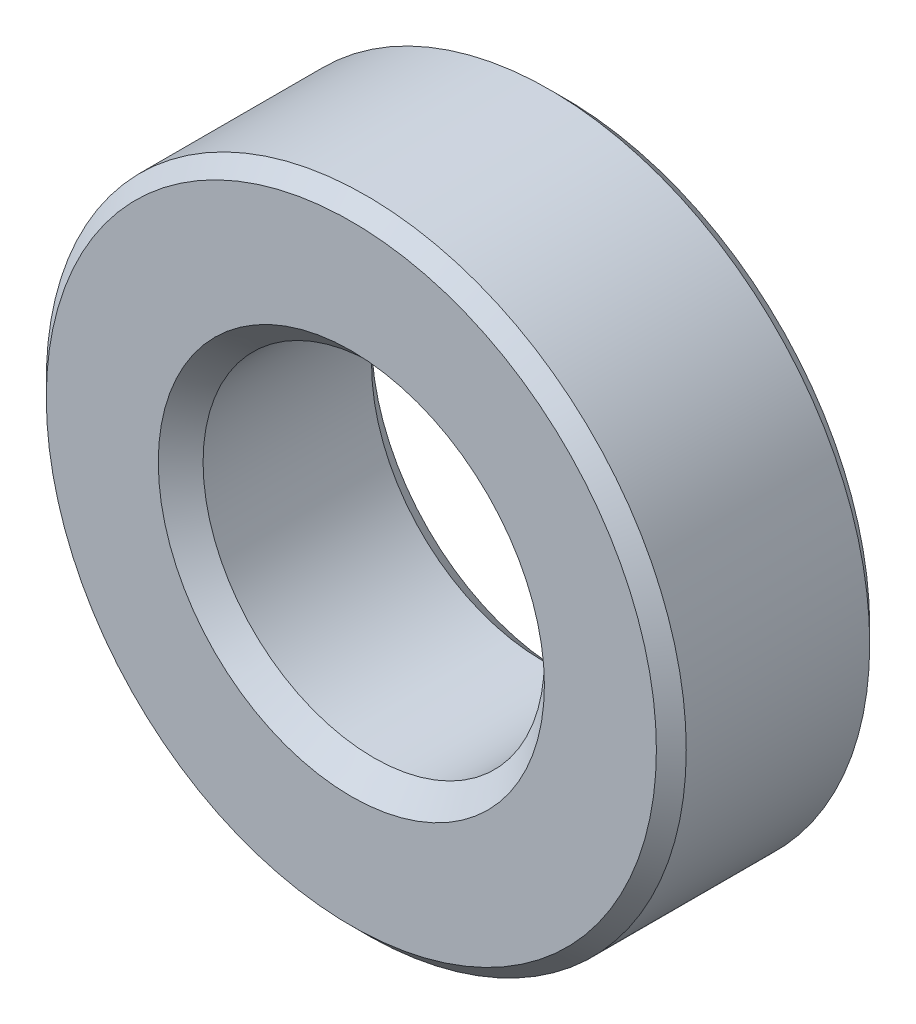
ISO-10303-21;
HEADER;
FILE_DESCRIPTION(('STEP AP214'),'2;1');
FILE_NAME('part.step','',(''),(''),'','','');
FILE_SCHEMA(('AUTOMOTIVE_DESIGN { 1 0 10303 214 1 1 1 1 }'));
ENDSEC;
DATA;
#1=APPLICATION_CONTEXT('core data for automotive mechanical design processes');
#2=APPLICATION_PROTOCOL_DEFINITION('international standard','automotive_design',2000,#1);
#3=PRODUCT_CONTEXT('',#1,'mechanical');
#4=PRODUCT('Part','Part','',(#3));
#5=PRODUCT_RELATED_PRODUCT_CATEGORY('part','',(#4));
#6=PRODUCT_DEFINITION_FORMATION('','',#4);
#7=PRODUCT_DEFINITION_CONTEXT('part definition',#1,'design');
#8=PRODUCT_DEFINITION('design','',#6,#7);
#9=PRODUCT_DEFINITION_SHAPE('','',#8);
#10=(LENGTH_UNIT() NAMED_UNIT(*) SI_UNIT(.MILLI.,.METRE.));
#11=(NAMED_UNIT(*) PLANE_ANGLE_UNIT() SI_UNIT($,.RADIAN.));
#12=(NAMED_UNIT(*) SI_UNIT($,.STERADIAN.) SOLID_ANGLE_UNIT());
#13=UNCERTAINTY_MEASURE_WITH_UNIT(LENGTH_MEASURE(1.E-05),#10,'distance_accuracy_value','');
#14=(GEOMETRIC_REPRESENTATION_CONTEXT(3) GLOBAL_UNCERTAINTY_ASSIGNED_CONTEXT((#13)) GLOBAL_UNIT_ASSIGNED_CONTEXT((#10,
#11,#12)) REPRESENTATION_CONTEXT('',''));
#15=CARTESIAN_POINT('',(0.,0.,0.));
#16=DIRECTION('',(0.,0.,1.));
#17=DIRECTION('',(1.,0.,0.));
#18=AXIS2_PLACEMENT_3D('',#15,#16,#17);
#19=CARTESIAN_POINT('',(0.,0.,-1.));
#20=DIRECTION('',(0.,0.,1.));
#21=DIRECTION('',(1.,0.,0.));
#22=AXIS2_PLACEMENT_3D('',#19,#20,#21);
#23=CYLINDRICAL_SURFACE('',#22,3.);
#24=CARTESIAN_POINT('',(0.,0.,0.859999999999999));
#25=DIRECTION('',(0.,0.,1.));
#26=DIRECTION('',(1.,0.,0.));
#27=AXIS2_PLACEMENT_3D('',#24,#25,#26);
#28=CIRCLE('',#27,3.);
#29=CARTESIAN_POINT('',(3.,0.,0.859999999999999));
#30=VERTEX_POINT('',#29);
#31=EDGE_CURVE('E69',#30,#30,#28,.F.);
#32=ORIENTED_EDGE('',*,*,#31,.T.);
#33=EDGE_LOOP('',(#32));
#34=FACE_BOUND('',#33,.T.);
#35=CARTESIAN_POINT('',(0.,0.,-0.859999999999999));
#36=DIRECTION('',(0.,0.,1.));
#37=DIRECTION('',(1.,0.,0.));
#38=AXIS2_PLACEMENT_3D('',#35,#36,#37);
#39=CIRCLE('',#38,3.);
#40=CARTESIAN_POINT('',(3.,0.,-0.859999999999999));
#41=VERTEX_POINT('',#40);
#42=EDGE_CURVE('E73',#41,#41,#39,.T.);
#43=ORIENTED_EDGE('',*,*,#42,.T.);
#44=EDGE_LOOP('',(#43));
#45=FACE_BOUND('',#44,.T.);
#46=ADVANCED_FACE('F39',(#34,#45),#23,.T.);
#47=CARTESIAN_POINT('',(0.,0.,-1.));
#48=DIRECTION('',(0.,0.,1.));
#49=DIRECTION('',(1.,0.,0.));
#50=AXIS2_PLACEMENT_3D('',#47,#48,#49);
#51=PLANE('',#50);
#52=CARTESIAN_POINT('',(0.,0.,-1.));
#53=DIRECTION('',(0.,0.,1.));
#54=DIRECTION('',(1.,0.,0.));
#55=AXIS2_PLACEMENT_3D('',#52,#53,#54);
#56=CIRCLE('',#55,1.81);
#57=CARTESIAN_POINT('',(1.81,0.,-1.));
#58=VERTEX_POINT('',#57);
#59=EDGE_CURVE('E10',#58,#58,#56,.T.);
#60=ORIENTED_EDGE('',*,*,#59,.T.);
#61=EDGE_LOOP('',(#60));
#62=FACE_BOUND('',#61,.T.);
#63=CARTESIAN_POINT('',(0.,0.,-1.));
#64=DIRECTION('',(0.,0.,1.));
#65=DIRECTION('',(1.,0.,0.));
#66=AXIS2_PLACEMENT_3D('',#63,#64,#65);
#67=CIRCLE('',#66,2.86);
#68=CARTESIAN_POINT('',(2.86,0.,-1.));
#69=VERTEX_POINT('',#68);
#70=EDGE_CURVE('E65',#69,#69,#67,.F.);
#71=ORIENTED_EDGE('',*,*,#70,.T.);
#72=EDGE_LOOP('',(#71));
#73=FACE_BOUND('',#72,.T.);
#74=ADVANCED_FACE('F102',(#62,#73),#51,.F.);
#75=CARTESIAN_POINT('',(0.,0.,-1.));
#76=DIRECTION('',(0.,0.,1.));
#77=DIRECTION('',(1.,0.,0.));
#78=AXIS2_PLACEMENT_3D('',#75,#76,#77);
#79=CYLINDRICAL_SURFACE('',#78,1.6);
#80=CARTESIAN_POINT('',(0.,0.,0.790000000000001));
#81=DIRECTION('',(0.,0.,1.));
#82=DIRECTION('',(1.,0.,0.));
#83=AXIS2_PLACEMENT_3D('',#80,#81,#82);
#84=CIRCLE('',#83,1.6);
#85=CARTESIAN_POINT('',(1.6,0.,0.790000000000001));
#86=VERTEX_POINT('',#85);
#87=EDGE_CURVE('E53',#86,#86,#84,.T.);
#88=ORIENTED_EDGE('',*,*,#87,.T.);
#89=EDGE_LOOP('',(#88));
#90=FACE_BOUND('',#89,.T.);
#91=CARTESIAN_POINT('',(0.,0.,-0.789999999999999));
#92=DIRECTION('',(0.,0.,1.));
#93=DIRECTION('',(1.,0.,0.));
#94=AXIS2_PLACEMENT_3D('',#91,#92,#93);
#95=CIRCLE('',#94,1.6);
#96=CARTESIAN_POINT('',(1.6,0.,-0.789999999999999));
#97=VERTEX_POINT('',#96);
#98=EDGE_CURVE('E59',#97,#97,#95,.F.);
#99=ORIENTED_EDGE('',*,*,#98,.T.);
#100=EDGE_LOOP('',(#99));
#101=FACE_BOUND('',#100,.T.);
#102=ADVANCED_FACE('F97',(#90,#101),#79,.F.);
#103=CARTESIAN_POINT('',(0.,0.,1.));
#104=DIRECTION('',(0.,0.,1.));
#105=DIRECTION('',(1.,0.,0.));
#106=AXIS2_PLACEMENT_3D('',#103,#104,#105);
#107=PLANE('',#106);
#108=CARTESIAN_POINT('',(0.,0.,1.));
#109=DIRECTION('',(0.,0.,1.));
#110=DIRECTION('',(1.,0.,0.));
#111=AXIS2_PLACEMENT_3D('',#108,#109,#110);
#112=CIRCLE('',#111,1.81);
#113=CARTESIAN_POINT('',(1.81,0.,1.));
#114=VERTEX_POINT('',#113);
#115=EDGE_CURVE('E47',#114,#114,#112,.F.);
#116=ORIENTED_EDGE('',*,*,#115,.T.);
#117=EDGE_LOOP('',(#116));
#118=FACE_BOUND('',#117,.T.);
#119=CARTESIAN_POINT('',(0.,0.,1.));
#120=DIRECTION('',(0.,0.,1.));
#121=DIRECTION('',(1.,0.,0.));
#122=AXIS2_PLACEMENT_3D('',#119,#120,#121);
#123=CIRCLE('',#122,2.86);
#124=CARTESIAN_POINT('',(2.86,0.,1.));
#125=VERTEX_POINT('',#124);
#126=EDGE_CURVE('E77',#125,#125,#123,.T.);
#127=ORIENTED_EDGE('',*,*,#126,.T.);
#128=EDGE_LOOP('',(#127));
#129=FACE_BOUND('',#128,.T.);
#130=ADVANCED_FACE('F83',(#118,#129),#107,.T.);
#131=CARTESIAN_POINT('',(0.,0.,1.));
#132=DIRECTION('',(0.,0.,-1.));
#133=DIRECTION('',(-1.,0.,0.));
#134=AXIS2_PLACEMENT_3D('',#131,#132,#133);
#135=CONICAL_SURFACE('',#134,2.86,0.785398163397447);
#136=ORIENTED_EDGE('',*,*,#31,.F.);
#137=EDGE_LOOP('',(#136));
#138=FACE_BOUND('',#137,.T.);
#139=ORIENTED_EDGE('',*,*,#126,.F.);
#140=EDGE_LOOP('',(#139));
#141=FACE_BOUND('',#140,.T.);
#142=ADVANCED_FACE('F85',(#138,#141),#135,.T.);
#143=CARTESIAN_POINT('',(0.,0.,-0.859999999999999));
#144=DIRECTION('',(0.,0.,1.));
#145=DIRECTION('',(1.,0.,0.));
#146=AXIS2_PLACEMENT_3D('',#143,#144,#145);
#147=CONICAL_SURFACE('',#146,3.,0.785398163397447);
#148=CARTESIAN_POINT('',(2.86,0.,-1.));
#149=CARTESIAN_POINT('',(2.86145833333333,0.,-0.998541666666667));
#150=CARTESIAN_POINT('',(2.86291666666667,0.,-0.997083333333334));
#151=CARTESIAN_POINT('',(2.86583333333333,0.,-0.994166666666667));
#152=CARTESIAN_POINT('',(2.86729166666667,0.,-0.992708333333334));
#153=CARTESIAN_POINT('',(2.87020833333333,0.,-0.989791666666667));
#154=CARTESIAN_POINT('',(2.87166666666667,0.,-0.988333333333334));
#155=CARTESIAN_POINT('',(2.87458333333333,0.,-0.985416666666667));
#156=CARTESIAN_POINT('',(2.87604166666667,0.,-0.983958333333333));
#157=CARTESIAN_POINT('',(2.87895833333333,0.,-0.981041666666667));
#158=CARTESIAN_POINT('',(2.88041666666667,0.,-0.979583333333333));
#159=CARTESIAN_POINT('',(2.88333333333333,0.,-0.976666666666667));
#160=CARTESIAN_POINT('',(2.88479166666667,0.,-0.975208333333333));
#161=CARTESIAN_POINT('',(2.88770833333333,0.,-0.972291666666667));
#162=CARTESIAN_POINT('',(2.88916666666667,0.,-0.970833333333333));
#163=CARTESIAN_POINT('',(2.89208333333333,0.,-0.967916666666667));
#164=CARTESIAN_POINT('',(2.89354166666667,0.,-0.966458333333333));
#165=CARTESIAN_POINT('',(2.89645833333333,0.,-0.963541666666667));
#166=CARTESIAN_POINT('',(2.89791666666667,0.,-0.962083333333333));
#167=CARTESIAN_POINT('',(2.90083333333333,0.,-0.959166666666666));
#168=CARTESIAN_POINT('',(2.90229166666667,0.,-0.957708333333333));
#169=CARTESIAN_POINT('',(2.90520833333333,0.,-0.954791666666666));
#170=CARTESIAN_POINT('',(2.90666666666667,0.,-0.953333333333333));
#171=CARTESIAN_POINT('',(2.90958333333333,0.,-0.950416666666666));
#172=CARTESIAN_POINT('',(2.91104166666667,0.,-0.948958333333333));
#173=CARTESIAN_POINT('',(2.91395833333333,0.,-0.946041666666666));
#174=CARTESIAN_POINT('',(2.91541666666667,0.,-0.944583333333333));
#175=CARTESIAN_POINT('',(2.91833333333333,0.,-0.941666666666666));
#176=CARTESIAN_POINT('',(2.91979166666667,0.,-0.940208333333333));
#177=CARTESIAN_POINT('',(2.92270833333333,0.,-0.937291666666666));
#178=CARTESIAN_POINT('',(2.92416666666667,0.,-0.935833333333333));
#179=CARTESIAN_POINT('',(2.92708333333333,0.,-0.932916666666666));
#180=CARTESIAN_POINT('',(2.92854166666667,0.,-0.931458333333333));
#181=CARTESIAN_POINT('',(2.93145833333333,0.,-0.928541666666666));
#182=CARTESIAN_POINT('',(2.93291666666667,0.,-0.927083333333333));
#183=CARTESIAN_POINT('',(2.93583333333333,0.,-0.924166666666666));
#184=CARTESIAN_POINT('',(2.93729166666667,0.,-0.922708333333333));
#185=CARTESIAN_POINT('',(2.94020833333333,0.,-0.919791666666666));
#186=CARTESIAN_POINT('',(2.94166666666667,0.,-0.918333333333333));
#187=CARTESIAN_POINT('',(2.94458333333333,0.,-0.915416666666666));
#188=CARTESIAN_POINT('',(2.94604166666667,0.,-0.913958333333333));
#189=CARTESIAN_POINT('',(2.94895833333333,0.,-0.911041666666666));
#190=CARTESIAN_POINT('',(2.95041666666667,0.,-0.909583333333333));
#191=CARTESIAN_POINT('',(2.95333333333333,0.,-0.906666666666666));
#192=CARTESIAN_POINT('',(2.95479166666667,0.,-0.905208333333333));
#193=CARTESIAN_POINT('',(2.95770833333333,0.,-0.902291666666666));
#194=CARTESIAN_POINT('',(2.95916666666667,0.,-0.900833333333333));
#195=CARTESIAN_POINT('',(2.96208333333333,0.,-0.897916666666666));
#196=CARTESIAN_POINT('',(2.96354166666667,0.,-0.896458333333333));
#197=CARTESIAN_POINT('',(2.96645833333333,0.,-0.893541666666666));
#198=CARTESIAN_POINT('',(2.96791666666667,0.,-0.892083333333333));
#199=CARTESIAN_POINT('',(2.97083333333333,0.,-0.889166666666666));
#200=CARTESIAN_POINT('',(2.97229166666667,0.,-0.887708333333332));
#201=CARTESIAN_POINT('',(2.97520833333333,0.,-0.884791666666666));
#202=CARTESIAN_POINT('',(2.97666666666667,0.,-0.883333333333332));
#203=CARTESIAN_POINT('',(2.97958333333333,0.,-0.880416666666666));
#204=CARTESIAN_POINT('',(2.98104166666667,0.,-0.878958333333332));
#205=CARTESIAN_POINT('',(2.98395833333333,0.,-0.876041666666666));
#206=CARTESIAN_POINT('',(2.98541666666667,0.,-0.874583333333332));
#207=CARTESIAN_POINT('',(2.98833333333333,0.,-0.871666666666666));
#208=CARTESIAN_POINT('',(2.98979166666667,0.,-0.870208333333332));
#209=CARTESIAN_POINT('',(2.99270833333333,0.,-0.867291666666665));
#210=CARTESIAN_POINT('',(2.99416666666667,0.,-0.865833333333332));
#211=CARTESIAN_POINT('',(2.99708333333333,0.,-0.862916666666665));
#212=CARTESIAN_POINT('',(2.99854166666667,0.,-0.861458333333332));
#213=CARTESIAN_POINT('',(3.,0.,-0.859999999999999));
#214=B_SPLINE_CURVE_WITH_KNOTS('',3,(#148,#149,#150,#151,#152,#153,#154,#155,#156,#157,#158,
#159,#160,#161,#162,#163,#164,#165,#166,#167,#168,#169,#170,#171,#172,#173,#174,#175,#176,#177,
#178,#179,#180,#181,#182,#183,#184,#185,#186,#187,#188,#189,#190,#191,#192,#193,#194,#195,#196,
#197,#198,#199,#200,#201,#202,#203,#204,#205,#206,#207,#208,#209,#210,#211,#212,#213),
.UNSPECIFIED.,.F.,.F.,(4,2,2,2,2,2,2,2,2,2,2,2,2,2,2,2,2,2,2,2,2,2,2,2,2,2,2,2,2,2,2,2,4),(0.,
0.00618718433538235,0.0123743686707647,0.018561553006147,0.0247487373415294,0.0309359216769117,
0.0371231060122941,0.0433102903476762,0.0494974746830585,0.0556846590184409,0.0618718433538232,
0.0680590276892056,0.0742462120245879,0.0804333963599702,0.0866205806953526,0.0928077650307349,
0.0989949493661173,0.1051821337015,0.111369318036882,0.117556502372264,0.123743686707647,
0.129930871043029,0.136118055378411,0.142305239713794,0.148492424049176,0.154679608384558,
0.160866792719941,0.167053977055323,0.173241161390706,0.179428345726088,0.18561553006147,
0.191802714396853,0.197989898732235),.UNSPECIFIED.);
#215=EDGE_CURVE('BSEAM87',#69,#41,#214,.T.);
#216=ORIENTED_EDGE('',*,*,#70,.F.);
#217=ORIENTED_EDGE('',*,*,#42,.F.);
#218=ORIENTED_EDGE('',*,*,#215,.T.);
#219=ORIENTED_EDGE('',*,*,#215,.F.);
#220=EDGE_LOOP('',(#216,#218,#217,#219));
#221=FACE_BOUND('',#220,.T.);
#222=ADVANCED_FACE('F87',(#221),#147,.T.);
#223=CARTESIAN_POINT('',(0.,0.,0.790000000000001));
#224=DIRECTION('',(0.,0.,1.));
#225=DIRECTION('',(1.,0.,0.));
#226=AXIS2_PLACEMENT_3D('',#223,#224,#225);
#227=CONICAL_SURFACE('',#226,1.6,0.78539816339745);
#228=ORIENTED_EDGE('',*,*,#115,.F.);
#229=EDGE_LOOP('',(#228));
#230=FACE_BOUND('',#229,.T.);
#231=ORIENTED_EDGE('',*,*,#87,.F.);
#232=EDGE_LOOP('',(#231));
#233=FACE_BOUND('',#232,.T.);
#234=ADVANCED_FACE('F94',(#230,#233),#227,.F.);
#235=CARTESIAN_POINT('',(0.,0.,-1.));
#236=DIRECTION('',(0.,0.,-1.));
#237=DIRECTION('',(-1.,0.,0.));
#238=AXIS2_PLACEMENT_3D('',#235,#236,#237);
#239=CONICAL_SURFACE('',#238,1.81,0.785398163397447);
#240=ORIENTED_EDGE('',*,*,#98,.F.);
#241=EDGE_LOOP('',(#240));
#242=FACE_BOUND('',#241,.T.);
#243=ORIENTED_EDGE('',*,*,#59,.F.);
#244=EDGE_LOOP('',(#243));
#245=FACE_BOUND('',#244,.T.);
#246=ADVANCED_FACE('F41',(#242,#245),#239,.F.);
#247=CLOSED_SHELL('',(#46,#74,#102,#130,#142,#222,#234,#246));
#248=MANIFOLD_SOLID_BREP('B2',#247);
#249=ADVANCED_BREP_SHAPE_REPRESENTATION('',(#18,#248),#14);
#250=SHAPE_DEFINITION_REPRESENTATION(#9,#249);
ENDSEC;
END-ISO-10303-21;
